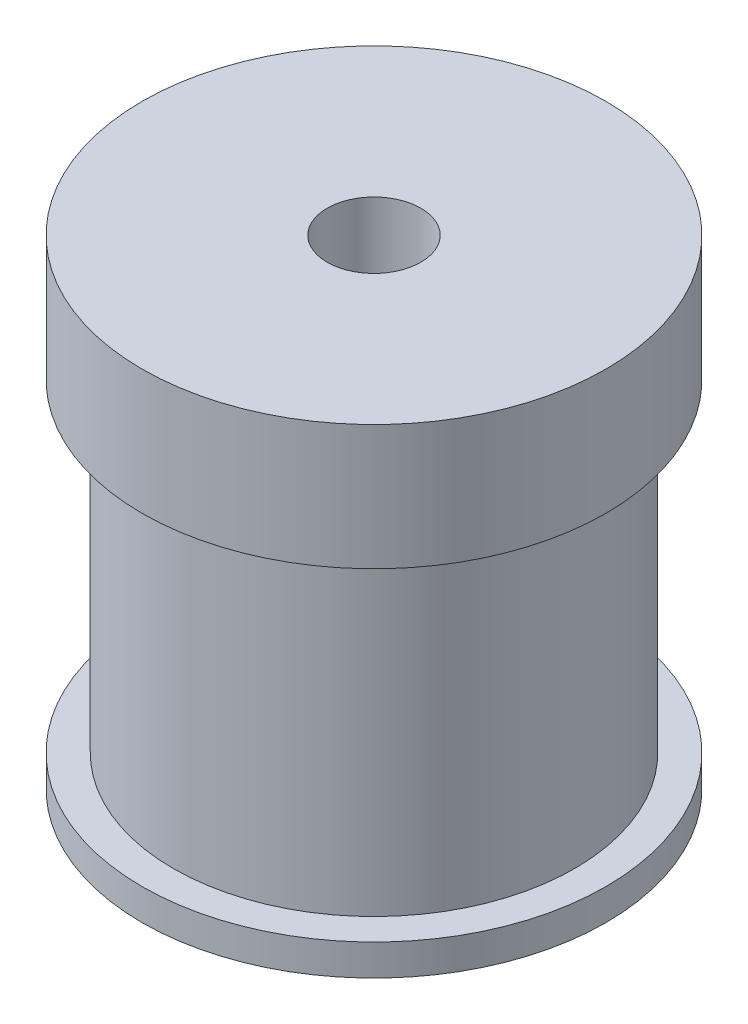
ISO-10303-21;
HEADER;
FILE_DESCRIPTION(('STEP AP214'),'2;1');
FILE_NAME('part.step','',(''),(''),'','','');
FILE_SCHEMA(('AUTOMOTIVE_DESIGN { 1 0 10303 214 1 1 1 1 }'));
ENDSEC;
DATA;
#1=APPLICATION_CONTEXT('core data for automotive mechanical design processes');
#2=APPLICATION_PROTOCOL_DEFINITION('international standard','automotive_design',2000,#1);
#3=PRODUCT_CONTEXT('',#1,'mechanical');
#4=PRODUCT('Part','Part','',(#3));
#5=PRODUCT_RELATED_PRODUCT_CATEGORY('part','',(#4));
#6=PRODUCT_DEFINITION_FORMATION('','',#4);
#7=PRODUCT_DEFINITION_CONTEXT('part definition',#1,'design');
#8=PRODUCT_DEFINITION('design','',#6,#7);
#9=PRODUCT_DEFINITION_SHAPE('','',#8);
#10=(LENGTH_UNIT() NAMED_UNIT(*) SI_UNIT(.MILLI.,.METRE.));
#11=(NAMED_UNIT(*) PLANE_ANGLE_UNIT() SI_UNIT($,.RADIAN.));
#12=(NAMED_UNIT(*) SI_UNIT($,.STERADIAN.) SOLID_ANGLE_UNIT());
#13=UNCERTAINTY_MEASURE_WITH_UNIT(LENGTH_MEASURE(1.E-05),#10,'distance_accuracy_value','');
#14=(GEOMETRIC_REPRESENTATION_CONTEXT(3) GLOBAL_UNCERTAINTY_ASSIGNED_CONTEXT((#13)) GLOBAL_UNIT_ASSIGNED_CONTEXT((#10,
#11,#12)) REPRESENTATION_CONTEXT('',''));
#15=CARTESIAN_POINT('',(0.,0.,0.));
#16=DIRECTION('',(0.,0.,1.));
#17=DIRECTION('',(1.,0.,0.));
#18=AXIS2_PLACEMENT_3D('',#15,#16,#17);
#19=CARTESIAN_POINT('',(0.,1.,0.));
#20=DIRECTION('',(0.,-1.,0.));
#21=DIRECTION('',(0.,0.,-1.));
#22=AXIS2_PLACEMENT_3D('',#19,#20,#21);
#23=CYLINDRICAL_SURFACE('',#22,7.425);
#24=CARTESIAN_POINT('',(0.,1.,0.));
#25=DIRECTION('',(0.,1.,0.));
#26=DIRECTION('',(0.,0.,1.));
#27=AXIS2_PLACEMENT_3D('',#24,#25,#26);
#28=CIRCLE('',#27,7.425);
#29=CARTESIAN_POINT('',(0.,1.,7.425));
#30=VERTEX_POINT('',#29);
#31=EDGE_CURVE('E38',#30,#30,#28,.T.);
#32=ORIENTED_EDGE('',*,*,#31,.F.);
#33=EDGE_LOOP('',(#32));
#34=FACE_BOUND('',#33,.T.);
#35=CARTESIAN_POINT('',(0.,0.,0.));
#36=DIRECTION('',(0.,1.,0.));
#37=DIRECTION('',(0.,0.,1.));
#38=AXIS2_PLACEMENT_3D('',#35,#36,#37);
#39=CIRCLE('',#38,7.425);
#40=CARTESIAN_POINT('',(0.,0.,7.425));
#41=VERTEX_POINT('',#40);
#42=EDGE_CURVE('E34',#41,#41,#39,.T.);
#43=ORIENTED_EDGE('',*,*,#42,.T.);
#44=EDGE_LOOP('',(#43));
#45=FACE_BOUND('',#44,.T.);
#46=ADVANCED_FACE('F31',(#34,#45),#23,.T.);
#47=CARTESIAN_POINT('',(0.,1.,0.));
#48=DIRECTION('',(0.,1.,0.));
#49=DIRECTION('',(0.,0.,1.));
#50=AXIS2_PLACEMENT_3D('',#47,#48,#49);
#51=PLANE('',#50);
#52=CARTESIAN_POINT('',(0.,1.,0.));
#53=DIRECTION('',(0.,1.,0.));
#54=DIRECTION('',(0.,0.,1.));
#55=AXIS2_PLACEMENT_3D('',#52,#53,#54);
#56=CIRCLE('',#55,6.425);
#57=CARTESIAN_POINT('',(0.,1.,6.425));
#58=VERTEX_POINT('',#57);
#59=EDGE_CURVE('E10',#58,#58,#56,.T.);
#60=ORIENTED_EDGE('',*,*,#59,.F.);
#61=EDGE_LOOP('',(#60));
#62=FACE_BOUND('',#61,.T.);
#63=ORIENTED_EDGE('',*,*,#31,.T.);
#64=EDGE_LOOP('',(#63));
#65=FACE_BOUND('',#64,.T.);
#66=ADVANCED_FACE('F89',(#62,#65),#51,.T.);
#67=CARTESIAN_POINT('',(0.,0.,0.));
#68=DIRECTION('',(0.,1.,0.));
#69=DIRECTION('',(0.,0.,1.));
#70=AXIS2_PLACEMENT_3D('',#67,#68,#69);
#71=PLANE('',#70);
#72=CARTESIAN_POINT('',(0.,0.,0.));
#73=DIRECTION('',(0.,1.,0.));
#74=DIRECTION('',(0.,0.,1.));
#75=AXIS2_PLACEMENT_3D('',#72,#73,#74);
#76=CIRCLE('',#75,1.5);
#77=CARTESIAN_POINT('',(0.,0.,1.5));
#78=VERTEX_POINT('',#77);
#79=EDGE_CURVE('E51',#78,#78,#76,.T.);
#80=ORIENTED_EDGE('',*,*,#79,.T.);
#81=EDGE_LOOP('',(#80));
#82=FACE_BOUND('',#81,.T.);
#83=ORIENTED_EDGE('',*,*,#42,.F.);
#84=EDGE_LOOP('',(#83));
#85=FACE_BOUND('',#84,.T.);
#86=ADVANCED_FACE('F60',(#82,#85),#71,.F.);
#87=CARTESIAN_POINT('',(0.,11.35,0.));
#88=DIRECTION('',(0.,-1.,0.));
#89=DIRECTION('',(0.,0.,-1.));
#90=AXIS2_PLACEMENT_3D('',#87,#88,#89);
#91=CYLINDRICAL_SURFACE('',#90,6.425);
#92=CARTESIAN_POINT('',(0.,11.35,0.));
#93=DIRECTION('',(0.,1.,0.));
#94=DIRECTION('',(0.,0.,1.));
#95=AXIS2_PLACEMENT_3D('',#92,#93,#94);
#96=CIRCLE('',#95,6.425);
#97=CARTESIAN_POINT('',(0.,11.35,6.425));
#98=VERTEX_POINT('',#97);
#99=EDGE_CURVE('E44',#98,#98,#96,.T.);
#100=ORIENTED_EDGE('',*,*,#99,.F.);
#101=EDGE_LOOP('',(#100));
#102=FACE_BOUND('',#101,.T.);
#103=ORIENTED_EDGE('',*,*,#59,.T.);
#104=EDGE_LOOP('',(#103));
#105=FACE_BOUND('',#104,.T.);
#106=ADVANCED_FACE('F79',(#102,#105),#91,.T.);
#107=CARTESIAN_POINT('',(0.,15.35,0.));
#108=DIRECTION('',(0.,-1.,0.));
#109=DIRECTION('',(0.,0.,-1.));
#110=AXIS2_PLACEMENT_3D('',#107,#108,#109);
#111=CYLINDRICAL_SURFACE('',#110,7.425);
#112=CARTESIAN_POINT('',(0.,15.35,0.));
#113=DIRECTION('',(0.,1.,0.));
#114=DIRECTION('',(0.,0.,1.));
#115=AXIS2_PLACEMENT_3D('',#112,#113,#114);
#116=CIRCLE('',#115,7.425);
#117=CARTESIAN_POINT('',(0.,15.35,7.425));
#118=VERTEX_POINT('',#117);
#119=EDGE_CURVE('E47',#118,#118,#116,.T.);
#120=ORIENTED_EDGE('',*,*,#119,.F.);
#121=EDGE_LOOP('',(#120));
#122=FACE_BOUND('',#121,.T.);
#123=CARTESIAN_POINT('',(0.,11.35,0.));
#124=DIRECTION('',(0.,1.,0.));
#125=DIRECTION('',(0.,0.,1.));
#126=AXIS2_PLACEMENT_3D('',#123,#124,#125);
#127=CIRCLE('',#126,7.425);
#128=CARTESIAN_POINT('',(0.,11.35,7.425));
#129=VERTEX_POINT('',#128);
#130=EDGE_CURVE('E48',#129,#129,#127,.T.);
#131=ORIENTED_EDGE('',*,*,#130,.T.);
#132=EDGE_LOOP('',(#131));
#133=FACE_BOUND('',#132,.T.);
#134=ADVANCED_FACE('F73',(#122,#133),#111,.T.);
#135=CARTESIAN_POINT('',(0.,15.35,0.));
#136=DIRECTION('',(0.,1.,0.));
#137=DIRECTION('',(0.,0.,1.));
#138=AXIS2_PLACEMENT_3D('',#135,#136,#137);
#139=PLANE('',#138);
#140=CARTESIAN_POINT('',(0.,15.35,0.));
#141=DIRECTION('',(0.,1.,0.));
#142=DIRECTION('',(0.,0.,1.));
#143=AXIS2_PLACEMENT_3D('',#140,#141,#142);
#144=CIRCLE('',#143,1.5);
#145=CARTESIAN_POINT('',(0.,15.35,1.5));
#146=VERTEX_POINT('',#145);
#147=EDGE_CURVE('E54',#146,#146,#144,.T.);
#148=ORIENTED_EDGE('',*,*,#147,.F.);
#149=EDGE_LOOP('',(#148));
#150=FACE_BOUND('',#149,.T.);
#151=ORIENTED_EDGE('',*,*,#119,.T.);
#152=EDGE_LOOP('',(#151));
#153=FACE_BOUND('',#152,.T.);
#154=ADVANCED_FACE('F70',(#150,#153),#139,.T.);
#155=CARTESIAN_POINT('',(0.,11.35,0.));
#156=DIRECTION('',(0.,1.,0.));
#157=DIRECTION('',(0.,0.,1.));
#158=AXIS2_PLACEMENT_3D('',#155,#156,#157);
#159=PLANE('',#158);
#160=ORIENTED_EDGE('',*,*,#99,.T.);
#161=EDGE_LOOP('',(#160));
#162=FACE_BOUND('',#161,.T.);
#163=ORIENTED_EDGE('',*,*,#130,.F.);
#164=EDGE_LOOP('',(#163));
#165=FACE_BOUND('',#164,.T.);
#166=ADVANCED_FACE('F66',(#162,#165),#159,.F.);
#167=CARTESIAN_POINT('',(0.,0.,0.));
#168=DIRECTION('',(0.,1.,0.));
#169=DIRECTION('',(0.,0.,1.));
#170=AXIS2_PLACEMENT_3D('',#167,#168,#169);
#171=CYLINDRICAL_SURFACE('',#170,1.5);
#172=ORIENTED_EDGE('',*,*,#79,.F.);
#173=EDGE_LOOP('',(#172));
#174=FACE_BOUND('',#173,.T.);
#175=ORIENTED_EDGE('',*,*,#147,.T.);
#176=EDGE_LOOP('',(#175));
#177=FACE_BOUND('',#176,.T.);
#178=ADVANCED_FACE('F63',(#174,#177),#171,.F.);
#179=CLOSED_SHELL('',(#46,#66,#86,#106,#134,#154,#166,#178));
#180=MANIFOLD_SOLID_BREP('B2',#179);
#181=ADVANCED_BREP_SHAPE_REPRESENTATION('',(#18,#180),#14);
#182=SHAPE_DEFINITION_REPRESENTATION(#9,#181);
ENDSEC;
END-ISO-10303-21;
